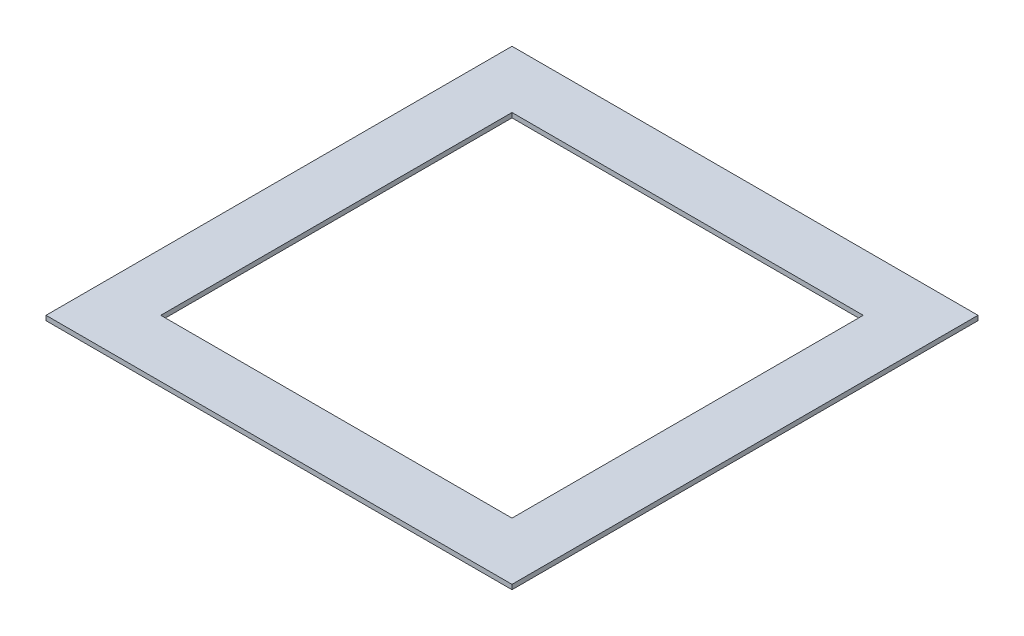
ISO-10303-21;
HEADER;
FILE_DESCRIPTION(('STEP AP214'),'2;1');
FILE_NAME('part.step','',(''),(''),'','','');
FILE_SCHEMA(('AUTOMOTIVE_DESIGN { 1 0 10303 214 1 1 1 1 }'));
ENDSEC;
DATA;
#1=APPLICATION_CONTEXT('core data for automotive mechanical design processes');
#2=APPLICATION_PROTOCOL_DEFINITION('international standard','automotive_design',2000,#1);
#3=PRODUCT_CONTEXT('',#1,'mechanical');
#4=PRODUCT('Part','Part','',(#3));
#5=PRODUCT_RELATED_PRODUCT_CATEGORY('part','',(#4));
#6=PRODUCT_DEFINITION_FORMATION('','',#4);
#7=PRODUCT_DEFINITION_CONTEXT('part definition',#1,'design');
#8=PRODUCT_DEFINITION('design','',#6,#7);
#9=PRODUCT_DEFINITION_SHAPE('','',#8);
#10=(LENGTH_UNIT() NAMED_UNIT(*) SI_UNIT(.MILLI.,.METRE.));
#11=(NAMED_UNIT(*) PLANE_ANGLE_UNIT() SI_UNIT($,.RADIAN.));
#12=(NAMED_UNIT(*) SI_UNIT($,.STERADIAN.) SOLID_ANGLE_UNIT());
#13=UNCERTAINTY_MEASURE_WITH_UNIT(LENGTH_MEASURE(1.E-05),#10,'distance_accuracy_value','');
#14=(GEOMETRIC_REPRESENTATION_CONTEXT(3) GLOBAL_UNCERTAINTY_ASSIGNED_CONTEXT((#13)) GLOBAL_UNIT_ASSIGNED_CONTEXT((#10,
#11,#12)) REPRESENTATION_CONTEXT('',''));
#15=CARTESIAN_POINT('',(0.,0.,0.));
#16=DIRECTION('',(0.,0.,1.));
#17=DIRECTION('',(1.,0.,0.));
#18=AXIS2_PLACEMENT_3D('',#15,#16,#17);
#19=CARTESIAN_POINT('',(0.,1.,0.));
#20=DIRECTION('',(0.,1.,0.));
#21=DIRECTION('',(0.,0.,1.));
#22=AXIS2_PLACEMENT_3D('',#19,#20,#21);
#23=PLANE('',#22);
#24=DIRECTION('',(0.,0.,-1.));
#25=VECTOR('',#24,1.);
#26=CARTESIAN_POINT('',(49.75,1.,-49.75));
#27=LINE('',#26,#25);
#28=CARTESIAN_POINT('',(49.75,1.,49.75));
#29=VERTEX_POINT('',#28);
#30=CARTESIAN_POINT('',(49.75,1.,-49.75));
#31=VERTEX_POINT('',#30);
#32=EDGE_CURVE('E134',#29,#31,#27,.T.);
#33=ORIENTED_EDGE('',*,*,#32,.T.);
#34=DIRECTION('',(-1.,0.,0.));
#35=VECTOR('',#34,1.);
#36=CARTESIAN_POINT('',(-49.75,1.,-49.75));
#37=LINE('',#36,#35);
#38=CARTESIAN_POINT('',(-49.75,1.,-49.75));
#39=VERTEX_POINT('',#38);
#40=EDGE_CURVE('E137',#31,#39,#37,.T.);
#41=ORIENTED_EDGE('',*,*,#40,.T.);
#42=DIRECTION('',(0.,0.,1.));
#43=VECTOR('',#42,1.);
#44=CARTESIAN_POINT('',(-49.75,1.,-49.75));
#45=LINE('',#44,#43);
#46=CARTESIAN_POINT('',(-49.75,1.,49.75));
#47=VERTEX_POINT('',#46);
#48=EDGE_CURVE('E140',#39,#47,#45,.T.);
#49=ORIENTED_EDGE('',*,*,#48,.T.);
#50=DIRECTION('',(1.,0.,0.));
#51=VECTOR('',#50,1.);
#52=CARTESIAN_POINT('',(-49.75,1.,49.75));
#53=LINE('',#52,#51);
#54=EDGE_CURVE('E142',#47,#29,#53,.T.);
#55=ORIENTED_EDGE('',*,*,#54,.T.);
#56=EDGE_LOOP('',(#33,#41,#49,#55));
#57=FACE_BOUND('',#56,.T.);
#58=DIRECTION('',(-1.,0.,0.));
#59=VECTOR('',#58,1.);
#60=CARTESIAN_POINT('',(-37.5,1.,-37.5));
#61=LINE('',#60,#59);
#62=CARTESIAN_POINT('',(37.5,1.,-37.5));
#63=VERTEX_POINT('',#62);
#64=CARTESIAN_POINT('',(-37.5,1.,-37.5));
#65=VERTEX_POINT('',#64);
#66=EDGE_CURVE('E106',#63,#65,#61,.T.);
#67=ORIENTED_EDGE('',*,*,#66,.F.);
#68=DIRECTION('',(0.,0.,-1.));
#69=VECTOR('',#68,1.);
#70=CARTESIAN_POINT('',(37.5,1.,-37.5));
#71=LINE('',#70,#69);
#72=CARTESIAN_POINT('',(37.5,1.,37.5));
#73=VERTEX_POINT('',#72);
#74=EDGE_CURVE('E98',#73,#63,#71,.T.);
#75=ORIENTED_EDGE('',*,*,#74,.F.);
#76=DIRECTION('',(1.,0.,0.));
#77=VECTOR('',#76,1.);
#78=CARTESIAN_POINT('',(-37.5,1.,37.5));
#79=LINE('',#78,#77);
#80=CARTESIAN_POINT('',(-37.5,1.,37.5));
#81=VERTEX_POINT('',#80);
#82=EDGE_CURVE('E120',#81,#73,#79,.T.);
#83=ORIENTED_EDGE('',*,*,#82,.F.);
#84=DIRECTION('',(0.,0.,1.));
#85=VECTOR('',#84,1.);
#86=CARTESIAN_POINT('',(-37.5,1.,-37.5));
#87=LINE('',#86,#85);
#88=EDGE_CURVE('E118',#65,#81,#87,.T.);
#89=ORIENTED_EDGE('',*,*,#88,.F.);
#90=EDGE_LOOP('',(#67,#75,#83,#89));
#91=FACE_BOUND('',#90,.T.);
#92=ADVANCED_FACE('F33',(#57,#91),#23,.T.);
#93=CARTESIAN_POINT('',(0.,0.,0.));
#94=DIRECTION('',(0.,1.,0.));
#95=DIRECTION('',(0.,0.,1.));
#96=AXIS2_PLACEMENT_3D('',#93,#94,#95);
#97=PLANE('',#96);
#98=DIRECTION('',(0.,0.,-1.));
#99=VECTOR('',#98,1.);
#100=CARTESIAN_POINT('',(49.75,0.,-49.75));
#101=LINE('',#100,#99);
#102=CARTESIAN_POINT('',(49.75,0.,49.75));
#103=VERTEX_POINT('',#102);
#104=CARTESIAN_POINT('',(49.75,0.,-49.75));
#105=VERTEX_POINT('',#104);
#106=EDGE_CURVE('E114',#103,#105,#101,.T.);
#107=ORIENTED_EDGE('',*,*,#106,.F.);
#108=DIRECTION('',(1.,0.,0.));
#109=VECTOR('',#108,1.);
#110=CARTESIAN_POINT('',(-49.75,0.,49.75));
#111=LINE('',#110,#109);
#112=CARTESIAN_POINT('',(-49.75,0.,49.75));
#113=VERTEX_POINT('',#112);
#114=EDGE_CURVE('E138',#113,#103,#111,.T.);
#115=ORIENTED_EDGE('',*,*,#114,.F.);
#116=DIRECTION('',(0.,0.,1.));
#117=VECTOR('',#116,1.);
#118=CARTESIAN_POINT('',(-49.75,0.,-49.75));
#119=LINE('',#118,#117);
#120=CARTESIAN_POINT('',(-49.75,0.,-49.75));
#121=VERTEX_POINT('',#120);
#122=EDGE_CURVE('E149',#121,#113,#119,.T.);
#123=ORIENTED_EDGE('',*,*,#122,.F.);
#124=DIRECTION('',(-1.,0.,0.));
#125=VECTOR('',#124,1.);
#126=CARTESIAN_POINT('',(-49.75,0.,-49.75));
#127=LINE('',#126,#125);
#128=EDGE_CURVE('E147',#105,#121,#127,.T.);
#129=ORIENTED_EDGE('',*,*,#128,.F.);
#130=EDGE_LOOP('',(#107,#115,#123,#129));
#131=FACE_BOUND('',#130,.T.);
#132=DIRECTION('',(0.,0.,-1.));
#133=VECTOR('',#132,1.);
#134=CARTESIAN_POINT('',(37.5,0.,-37.5));
#135=LINE('',#134,#133);
#136=CARTESIAN_POINT('',(37.5,0.,37.5));
#137=VERTEX_POINT('',#136);
#138=CARTESIAN_POINT('',(37.5,0.,-37.5));
#139=VERTEX_POINT('',#138);
#140=EDGE_CURVE('E56',#137,#139,#135,.T.);
#141=ORIENTED_EDGE('',*,*,#140,.T.);
#142=DIRECTION('',(-1.,0.,0.));
#143=VECTOR('',#142,1.);
#144=CARTESIAN_POINT('',(-37.5,0.,-37.5));
#145=LINE('',#144,#143);
#146=CARTESIAN_POINT('',(-37.5,0.,-37.5));
#147=VERTEX_POINT('',#146);
#148=EDGE_CURVE('E113',#139,#147,#145,.T.);
#149=ORIENTED_EDGE('',*,*,#148,.T.);
#150=DIRECTION('',(0.,0.,1.));
#151=VECTOR('',#150,1.);
#152=CARTESIAN_POINT('',(-37.5,0.,-37.5));
#153=LINE('',#152,#151);
#154=CARTESIAN_POINT('',(-37.5,0.,37.5));
#155=VERTEX_POINT('',#154);
#156=EDGE_CURVE('E126',#147,#155,#153,.T.);
#157=ORIENTED_EDGE('',*,*,#156,.T.);
#158=DIRECTION('',(1.,0.,0.));
#159=VECTOR('',#158,1.);
#160=CARTESIAN_POINT('',(-37.5,0.,37.5));
#161=LINE('',#160,#159);
#162=EDGE_CURVE('E107',#155,#137,#161,.T.);
#163=ORIENTED_EDGE('',*,*,#162,.T.);
#164=EDGE_LOOP('',(#141,#149,#157,#163));
#165=FACE_BOUND('',#164,.T.);
#166=ADVANCED_FACE('F167',(#131,#165),#97,.F.);
#167=CARTESIAN_POINT('',(49.75,1.,-49.75));
#168=DIRECTION('',(-1.,0.,0.));
#169=DIRECTION('',(0.,0.,1.));
#170=AXIS2_PLACEMENT_3D('',#167,#168,#169);
#171=PLANE('',#170);
#172=ORIENTED_EDGE('',*,*,#106,.T.);
#173=DIRECTION('',(0.,-1.,0.));
#174=VECTOR('',#173,1.);
#175=CARTESIAN_POINT('',(49.75,1.,-49.75));
#176=LINE('',#175,#174);
#177=EDGE_CURVE('E11',#31,#105,#176,.T.);
#178=ORIENTED_EDGE('',*,*,#177,.F.);
#179=ORIENTED_EDGE('',*,*,#32,.F.);
#180=DIRECTION('',(0.,-1.,0.));
#181=VECTOR('',#180,1.);
#182=CARTESIAN_POINT('',(49.75,1.,49.75));
#183=LINE('',#182,#181);
#184=EDGE_CURVE('E144',#29,#103,#183,.T.);
#185=ORIENTED_EDGE('',*,*,#184,.T.);
#186=EDGE_LOOP('',(#172,#178,#179,#185));
#187=FACE_BOUND('',#186,.T.);
#188=ADVANCED_FACE('F35',(#187),#171,.F.);
#189=CARTESIAN_POINT('',(-49.75,1.,-49.75));
#190=DIRECTION('',(0.,0.,1.));
#191=DIRECTION('',(1.,0.,0.));
#192=AXIS2_PLACEMENT_3D('',#189,#190,#191);
#193=PLANE('',#192);
#194=ORIENTED_EDGE('',*,*,#128,.T.);
#195=DIRECTION('',(0.,-1.,0.));
#196=VECTOR('',#195,1.);
#197=CARTESIAN_POINT('',(-49.75,1.,-49.75));
#198=LINE('',#197,#196);
#199=EDGE_CURVE('E41',#39,#121,#198,.T.);
#200=ORIENTED_EDGE('',*,*,#199,.F.);
#201=ORIENTED_EDGE('',*,*,#40,.F.);
#202=ORIENTED_EDGE('',*,*,#177,.T.);
#203=EDGE_LOOP('',(#194,#200,#201,#202));
#204=FACE_BOUND('',#203,.T.);
#205=ADVANCED_FACE('F177',(#204),#193,.F.);
#206=CARTESIAN_POINT('',(-49.75,1.,-49.75));
#207=DIRECTION('',(1.,0.,0.));
#208=DIRECTION('',(0.,0.,-1.));
#209=AXIS2_PLACEMENT_3D('',#206,#207,#208);
#210=PLANE('',#209);
#211=ORIENTED_EDGE('',*,*,#122,.T.);
#212=DIRECTION('',(0.,-1.,0.));
#213=VECTOR('',#212,1.);
#214=CARTESIAN_POINT('',(-49.75,1.,49.75));
#215=LINE('',#214,#213);
#216=EDGE_CURVE('E154',#47,#113,#215,.T.);
#217=ORIENTED_EDGE('',*,*,#216,.F.);
#218=ORIENTED_EDGE('',*,*,#48,.F.);
#219=ORIENTED_EDGE('',*,*,#199,.T.);
#220=EDGE_LOOP('',(#211,#217,#218,#219));
#221=FACE_BOUND('',#220,.T.);
#222=ADVANCED_FACE('F161',(#221),#210,.F.);
#223=CARTESIAN_POINT('',(-49.75,1.,49.75));
#224=DIRECTION('',(0.,0.,-1.));
#225=DIRECTION('',(-1.,0.,0.));
#226=AXIS2_PLACEMENT_3D('',#223,#224,#225);
#227=PLANE('',#226);
#228=ORIENTED_EDGE('',*,*,#114,.T.);
#229=ORIENTED_EDGE('',*,*,#184,.F.);
#230=ORIENTED_EDGE('',*,*,#54,.F.);
#231=ORIENTED_EDGE('',*,*,#216,.T.);
#232=EDGE_LOOP('',(#228,#229,#230,#231));
#233=FACE_BOUND('',#232,.T.);
#234=ADVANCED_FACE('F171',(#233),#227,.F.);
#235=CARTESIAN_POINT('',(37.5,1.,-37.5));
#236=DIRECTION('',(-1.,0.,0.));
#237=DIRECTION('',(0.,0.,1.));
#238=AXIS2_PLACEMENT_3D('',#235,#236,#237);
#239=PLANE('',#238);
#240=ORIENTED_EDGE('',*,*,#140,.F.);
#241=DIRECTION('',(0.,-1.,0.));
#242=VECTOR('',#241,1.);
#243=CARTESIAN_POINT('',(37.5,1.,37.5));
#244=LINE('',#243,#242);
#245=EDGE_CURVE('E102',#73,#137,#244,.T.);
#246=ORIENTED_EDGE('',*,*,#245,.F.);
#247=ORIENTED_EDGE('',*,*,#74,.T.);
#248=DIRECTION('',(0.,-1.,0.));
#249=VECTOR('',#248,1.);
#250=CARTESIAN_POINT('',(37.5,1.,-37.5));
#251=LINE('',#250,#249);
#252=EDGE_CURVE('E101',#63,#139,#251,.T.);
#253=ORIENTED_EDGE('',*,*,#252,.T.);
#254=EDGE_LOOP('',(#240,#246,#247,#253));
#255=FACE_BOUND('',#254,.T.);
#256=ADVANCED_FACE('F100',(#255),#239,.T.);
#257=CARTESIAN_POINT('',(-37.5,1.,-37.5));
#258=DIRECTION('',(0.,0.,1.));
#259=DIRECTION('',(1.,0.,0.));
#260=AXIS2_PLACEMENT_3D('',#257,#258,#259);
#261=PLANE('',#260);
#262=ORIENTED_EDGE('',*,*,#148,.F.);
#263=ORIENTED_EDGE('',*,*,#252,.F.);
#264=ORIENTED_EDGE('',*,*,#66,.T.);
#265=DIRECTION('',(0.,-1.,0.));
#266=VECTOR('',#265,1.);
#267=CARTESIAN_POINT('',(-37.5,1.,-37.5));
#268=LINE('',#267,#266);
#269=EDGE_CURVE('E115',#65,#147,#268,.T.);
#270=ORIENTED_EDGE('',*,*,#269,.T.);
#271=EDGE_LOOP('',(#262,#263,#264,#270));
#272=FACE_BOUND('',#271,.T.);
#273=ADVANCED_FACE('F110',(#272),#261,.T.);
#274=CARTESIAN_POINT('',(-37.5,1.,-37.5));
#275=DIRECTION('',(1.,0.,0.));
#276=DIRECTION('',(0.,0.,-1.));
#277=AXIS2_PLACEMENT_3D('',#274,#275,#276);
#278=PLANE('',#277);
#279=ORIENTED_EDGE('',*,*,#156,.F.);
#280=ORIENTED_EDGE('',*,*,#269,.F.);
#281=ORIENTED_EDGE('',*,*,#88,.T.);
#282=DIRECTION('',(0.,-1.,0.));
#283=VECTOR('',#282,1.);
#284=CARTESIAN_POINT('',(-37.5,1.,37.5));
#285=LINE('',#284,#283);
#286=EDGE_CURVE('E48',#81,#155,#285,.T.);
#287=ORIENTED_EDGE('',*,*,#286,.T.);
#288=EDGE_LOOP('',(#279,#280,#281,#287));
#289=FACE_BOUND('',#288,.T.);
#290=ADVANCED_FACE('F200',(#289),#278,.T.);
#291=CARTESIAN_POINT('',(-37.5,1.,37.5));
#292=DIRECTION('',(0.,0.,-1.));
#293=DIRECTION('',(-1.,0.,0.));
#294=AXIS2_PLACEMENT_3D('',#291,#292,#293);
#295=PLANE('',#294);
#296=ORIENTED_EDGE('',*,*,#162,.F.);
#297=ORIENTED_EDGE('',*,*,#286,.F.);
#298=ORIENTED_EDGE('',*,*,#82,.T.);
#299=ORIENTED_EDGE('',*,*,#245,.T.);
#300=EDGE_LOOP('',(#296,#297,#298,#299));
#301=FACE_BOUND('',#300,.T.);
#302=ADVANCED_FACE('F204',(#301),#295,.T.);
#303=CLOSED_SHELL('',(#92,#166,#188,#205,#222,#234,#256,#273,#290,#302));
#304=MANIFOLD_SOLID_BREP('B2',#303);
#305=ADVANCED_BREP_SHAPE_REPRESENTATION('',(#18,#304),#14);
#306=SHAPE_DEFINITION_REPRESENTATION(#9,#305);
ENDSEC;
END-ISO-10303-21;
